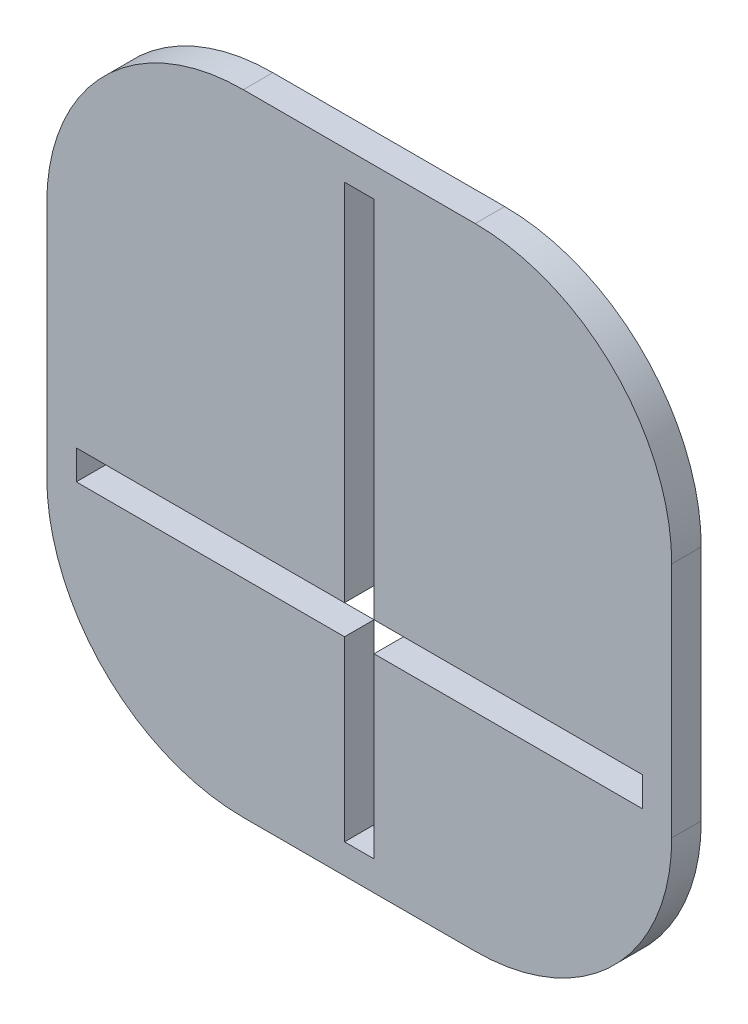
ISO-10303-21;
HEADER;
FILE_DESCRIPTION(('STEP AP214'),'2;1');
FILE_NAME('part.step','',(''),(''),'','','');
FILE_SCHEMA(('AUTOMOTIVE_DESIGN { 1 0 10303 214 1 1 1 1 }'));
ENDSEC;
DATA;
#1=APPLICATION_CONTEXT('core data for automotive mechanical design processes');
#2=APPLICATION_PROTOCOL_DEFINITION('international standard','automotive_design',2000,#1);
#3=PRODUCT_CONTEXT('',#1,'mechanical');
#4=PRODUCT('Part','Part','',(#3));
#5=PRODUCT_RELATED_PRODUCT_CATEGORY('part','',(#4));
#6=PRODUCT_DEFINITION_FORMATION('','',#4);
#7=PRODUCT_DEFINITION_CONTEXT('part definition',#1,'design');
#8=PRODUCT_DEFINITION('design','',#6,#7);
#9=PRODUCT_DEFINITION_SHAPE('','',#8);
#10=(LENGTH_UNIT() NAMED_UNIT(*) SI_UNIT(.MILLI.,.METRE.));
#11=(NAMED_UNIT(*) PLANE_ANGLE_UNIT() SI_UNIT($,.RADIAN.));
#12=(NAMED_UNIT(*) SI_UNIT($,.STERADIAN.) SOLID_ANGLE_UNIT());
#13=UNCERTAINTY_MEASURE_WITH_UNIT(LENGTH_MEASURE(1.E-05),#10,'distance_accuracy_value','');
#14=(GEOMETRIC_REPRESENTATION_CONTEXT(3) GLOBAL_UNCERTAINTY_ASSIGNED_CONTEXT((#13)) GLOBAL_UNIT_ASSIGNED_CONTEXT((#10,
#11,#12)) REPRESENTATION_CONTEXT('',''));
#15=CARTESIAN_POINT('',(0.,0.,0.));
#16=DIRECTION('',(0.,0.,1.));
#17=DIRECTION('',(1.,0.,0.));
#18=AXIS2_PLACEMENT_3D('',#15,#16,#17);
#19=CARTESIAN_POINT('',(0.,32.0700000000001,3.));
#20=DIRECTION('',(0.,-1.,0.));
#21=DIRECTION('',(1.,0.,0.));
#22=AXIS2_PLACEMENT_3D('',#19,#20,#21);
#23=PLANE('',#22);
#24=DIRECTION('',(-1.,0.,0.));
#25=VECTOR('',#24,1.);
#26=CARTESIAN_POINT('',(0.,32.0700000000001,0.));
#27=LINE('',#26,#25);
#28=CARTESIAN_POINT('',(11.8,32.0700000000001,0.));
#29=VERTEX_POINT('',#28);
#30=CARTESIAN_POINT('',(-11.8,32.0700000000001,0.));
#31=VERTEX_POINT('',#30);
#32=EDGE_CURVE('E254',#29,#31,#27,.T.);
#33=ORIENTED_EDGE('',*,*,#32,.T.);
#34=DIRECTION('',(0.,0.,-1.));
#35=VECTOR('',#34,1.);
#36=CARTESIAN_POINT('',(-11.8,32.0700000000001,3.));
#37=LINE('',#36,#35);
#38=CARTESIAN_POINT('',(-11.8,32.0700000000001,3.));
#39=VERTEX_POINT('',#38);
#40=EDGE_CURVE('E11',#39,#31,#37,.T.);
#41=ORIENTED_EDGE('',*,*,#40,.F.);
#42=DIRECTION('',(-1.,0.,0.));
#43=VECTOR('',#42,1.);
#44=CARTESIAN_POINT('',(0.,32.0700000000001,3.));
#45=LINE('',#44,#43);
#46=CARTESIAN_POINT('',(11.8,32.0700000000001,3.));
#47=VERTEX_POINT('',#46);
#48=EDGE_CURVE('E405',#47,#39,#45,.T.);
#49=ORIENTED_EDGE('',*,*,#48,.F.);
#50=DIRECTION('',(0.,0.,-1.));
#51=VECTOR('',#50,1.);
#52=CARTESIAN_POINT('',(11.8,32.0700000000001,3.));
#53=LINE('',#52,#51);
#54=EDGE_CURVE('E281',#47,#29,#53,.T.);
#55=ORIENTED_EDGE('',*,*,#54,.T.);
#56=EDGE_LOOP('',(#33,#41,#49,#55));
#57=FACE_BOUND('',#56,.T.);
#58=ADVANCED_FACE('F45',(#57),#23,.F.);
#59=CARTESIAN_POINT('',(-11.8,12.07,3.));
#60=DIRECTION('',(0.,0.,-1.));
#61=DIRECTION('',(-1.,0.,0.));
#62=AXIS2_PLACEMENT_3D('',#59,#60,#61);
#63=CYLINDRICAL_SURFACE('',#62,20.);
#64=CARTESIAN_POINT('',(-11.8,12.07,0.));
#65=DIRECTION('',(0.,0.,1.));
#66=DIRECTION('',(1.,0.,0.));
#67=AXIS2_PLACEMENT_3D('',#64,#65,#66);
#68=CIRCLE('',#67,20.);
#69=CARTESIAN_POINT('',(-31.8,12.07,0.));
#70=VERTEX_POINT('',#69);
#71=EDGE_CURVE('E258',#31,#70,#68,.T.);
#72=ORIENTED_EDGE('',*,*,#71,.T.);
#73=DIRECTION('',(0.,0.,-1.));
#74=VECTOR('',#73,1.);
#75=CARTESIAN_POINT('',(-31.8,12.07,3.));
#76=LINE('',#75,#74);
#77=CARTESIAN_POINT('',(-31.8,12.07,3.));
#78=VERTEX_POINT('',#77);
#79=EDGE_CURVE('E56',#78,#70,#76,.T.);
#80=ORIENTED_EDGE('',*,*,#79,.F.);
#81=CARTESIAN_POINT('',(-11.8,12.07,3.));
#82=DIRECTION('',(0.,0.,1.));
#83=DIRECTION('',(1.,0.,0.));
#84=AXIS2_PLACEMENT_3D('',#81,#82,#83);
#85=CIRCLE('',#84,20.);
#86=EDGE_CURVE('E408',#39,#78,#85,.T.);
#87=ORIENTED_EDGE('',*,*,#86,.F.);
#88=ORIENTED_EDGE('',*,*,#40,.T.);
#89=EDGE_LOOP('',(#72,#80,#87,#88));
#90=FACE_BOUND('',#89,.T.);
#91=ADVANCED_FACE('F440',(#90),#63,.T.);
#92=CARTESIAN_POINT('',(-31.8,0.,3.));
#93=DIRECTION('',(-1.,0.,0.));
#94=DIRECTION('',(0.,-1.,0.));
#95=AXIS2_PLACEMENT_3D('',#92,#93,#94);
#96=PLANE('',#95);
#97=DIRECTION('',(0.,1.,0.));
#98=VECTOR('',#97,1.);
#99=CARTESIAN_POINT('',(-31.8,0.,0.));
#100=LINE('',#99,#98);
#101=CARTESIAN_POINT('',(-31.8,-12.07,0.));
#102=VERTEX_POINT('',#101);
#103=EDGE_CURVE('E262',#102,#70,#100,.T.);
#104=ORIENTED_EDGE('',*,*,#103,.F.);
#105=DIRECTION('',(0.,0.,-1.));
#106=VECTOR('',#105,1.);
#107=CARTESIAN_POINT('',(-31.8,-12.07,3.));
#108=LINE('',#107,#106);
#109=CARTESIAN_POINT('',(-31.8,-12.07,3.));
#110=VERTEX_POINT('',#109);
#111=EDGE_CURVE('E291',#110,#102,#108,.T.);
#112=ORIENTED_EDGE('',*,*,#111,.F.);
#113=DIRECTION('',(0.,1.,0.));
#114=VECTOR('',#113,1.);
#115=CARTESIAN_POINT('',(-31.8,0.,3.));
#116=LINE('',#115,#114);
#117=EDGE_CURVE('E411',#110,#78,#116,.T.);
#118=ORIENTED_EDGE('',*,*,#117,.T.);
#119=ORIENTED_EDGE('',*,*,#79,.T.);
#120=EDGE_LOOP('',(#104,#112,#118,#119));
#121=FACE_BOUND('',#120,.T.);
#122=ADVANCED_FACE('F445',(#121),#96,.T.);
#123=CARTESIAN_POINT('',(-11.8,-12.07,3.));
#124=DIRECTION('',(0.,0.,-1.));
#125=DIRECTION('',(-1.,0.,0.));
#126=AXIS2_PLACEMENT_3D('',#123,#124,#125);
#127=CYLINDRICAL_SURFACE('',#126,20.);
#128=CARTESIAN_POINT('',(-11.8,-12.07,0.));
#129=DIRECTION('',(0.,0.,1.));
#130=DIRECTION('',(1.,0.,0.));
#131=AXIS2_PLACEMENT_3D('',#128,#129,#130);
#132=CIRCLE('',#131,20.);
#133=CARTESIAN_POINT('',(-11.8,-32.07,0.));
#134=VERTEX_POINT('',#133);
#135=EDGE_CURVE('E266',#134,#102,#132,.F.);
#136=ORIENTED_EDGE('',*,*,#135,.F.);
#137=DIRECTION('',(0.,0.,-1.));
#138=VECTOR('',#137,1.);
#139=CARTESIAN_POINT('',(-11.8,-32.07,3.));
#140=LINE('',#139,#138);
#141=CARTESIAN_POINT('',(-11.8,-32.07,3.));
#142=VERTEX_POINT('',#141);
#143=EDGE_CURVE('E288',#142,#134,#140,.T.);
#144=ORIENTED_EDGE('',*,*,#143,.F.);
#145=CARTESIAN_POINT('',(-11.8,-12.07,3.));
#146=DIRECTION('',(0.,0.,1.));
#147=DIRECTION('',(1.,0.,0.));
#148=AXIS2_PLACEMENT_3D('',#145,#146,#147);
#149=CIRCLE('',#148,20.);
#150=EDGE_CURVE('E415',#142,#110,#149,.F.);
#151=ORIENTED_EDGE('',*,*,#150,.T.);
#152=ORIENTED_EDGE('',*,*,#111,.T.);
#153=EDGE_LOOP('',(#136,#144,#151,#152));
#154=FACE_BOUND('',#153,.T.);
#155=ADVANCED_FACE('F608',(#154),#127,.T.);
#156=CARTESIAN_POINT('',(0.,-32.07,3.));
#157=DIRECTION('',(0.,-1.,0.));
#158=DIRECTION('',(1.,0.,0.));
#159=AXIS2_PLACEMENT_3D('',#156,#157,#158);
#160=PLANE('',#159);
#161=DIRECTION('',(-1.,0.,0.));
#162=VECTOR('',#161,1.);
#163=CARTESIAN_POINT('',(0.,-32.07,0.));
#164=LINE('',#163,#162);
#165=CARTESIAN_POINT('',(11.8,-32.07,0.));
#166=VERTEX_POINT('',#165);
#167=EDGE_CURVE('E270',#166,#134,#164,.T.);
#168=ORIENTED_EDGE('',*,*,#167,.F.);
#169=DIRECTION('',(0.,0.,-1.));
#170=VECTOR('',#169,1.);
#171=CARTESIAN_POINT('',(11.8,-32.07,3.));
#172=LINE('',#171,#170);
#173=CARTESIAN_POINT('',(11.8,-32.07,3.));
#174=VERTEX_POINT('',#173);
#175=EDGE_CURVE('E212',#174,#166,#172,.T.);
#176=ORIENTED_EDGE('',*,*,#175,.F.);
#177=DIRECTION('',(-1.,0.,0.));
#178=VECTOR('',#177,1.);
#179=CARTESIAN_POINT('',(0.,-32.07,3.));
#180=LINE('',#179,#178);
#181=EDGE_CURVE('E203',#174,#142,#180,.T.);
#182=ORIENTED_EDGE('',*,*,#181,.T.);
#183=ORIENTED_EDGE('',*,*,#143,.T.);
#184=EDGE_LOOP('',(#168,#176,#182,#183));
#185=FACE_BOUND('',#184,.T.);
#186=ADVANCED_FACE('F421',(#185),#160,.T.);
#187=CARTESIAN_POINT('',(11.8,-12.07,3.));
#188=DIRECTION('',(0.,0.,-1.));
#189=DIRECTION('',(-1.,0.,0.));
#190=AXIS2_PLACEMENT_3D('',#187,#188,#189);
#191=CYLINDRICAL_SURFACE('',#190,20.);
#192=CARTESIAN_POINT('',(11.8,-12.07,0.));
#193=DIRECTION('',(0.,0.,1.));
#194=DIRECTION('',(1.,0.,0.));
#195=AXIS2_PLACEMENT_3D('',#192,#193,#194);
#196=CIRCLE('',#195,20.);
#197=CARTESIAN_POINT('',(31.8,-12.07,0.));
#198=VERTEX_POINT('',#197);
#199=EDGE_CURVE('E210',#166,#198,#196,.T.);
#200=ORIENTED_EDGE('',*,*,#199,.T.);
#201=DIRECTION('',(0.,0.,-1.));
#202=VECTOR('',#201,1.);
#203=CARTESIAN_POINT('',(31.8,-12.07,3.));
#204=LINE('',#203,#202);
#205=CARTESIAN_POINT('',(31.8,-12.07,3.));
#206=VERTEX_POINT('',#205);
#207=EDGE_CURVE('E207',#206,#198,#204,.T.);
#208=ORIENTED_EDGE('',*,*,#207,.F.);
#209=CARTESIAN_POINT('',(11.8,-12.07,3.));
#210=DIRECTION('',(0.,0.,1.));
#211=DIRECTION('',(1.,0.,0.));
#212=AXIS2_PLACEMENT_3D('',#209,#210,#211);
#213=CIRCLE('',#212,20.);
#214=EDGE_CURVE('E196',#174,#206,#213,.T.);
#215=ORIENTED_EDGE('',*,*,#214,.F.);
#216=ORIENTED_EDGE('',*,*,#175,.T.);
#217=EDGE_LOOP('',(#200,#208,#215,#216));
#218=FACE_BOUND('',#217,.T.);
#219=ADVANCED_FACE('F208',(#218),#191,.T.);
#220=CARTESIAN_POINT('',(31.8,0.,3.));
#221=DIRECTION('',(-1.,0.,0.));
#222=DIRECTION('',(0.,0.,1.));
#223=AXIS2_PLACEMENT_3D('',#220,#221,#222);
#224=PLANE('',#223);
#225=DIRECTION('',(0.,1.,0.));
#226=VECTOR('',#225,1.);
#227=CARTESIAN_POINT('',(31.8,0.,0.));
#228=LINE('',#227,#226);
#229=CARTESIAN_POINT('',(31.8,12.0700000000001,0.));
#230=VERTEX_POINT('',#229);
#231=EDGE_CURVE('E130',#198,#230,#228,.T.);
#232=ORIENTED_EDGE('',*,*,#231,.T.);
#233=DIRECTION('',(0.,0.,-1.));
#234=VECTOR('',#233,1.);
#235=CARTESIAN_POINT('',(31.8,12.0700000000001,3.));
#236=LINE('',#235,#234);
#237=CARTESIAN_POINT('',(31.8,12.0700000000001,3.));
#238=VERTEX_POINT('',#237);
#239=EDGE_CURVE('E213',#238,#230,#236,.T.);
#240=ORIENTED_EDGE('',*,*,#239,.F.);
#241=DIRECTION('',(0.,1.,0.));
#242=VECTOR('',#241,1.);
#243=CARTESIAN_POINT('',(31.8,0.,3.));
#244=LINE('',#243,#242);
#245=EDGE_CURVE('E200',#206,#238,#244,.T.);
#246=ORIENTED_EDGE('',*,*,#245,.F.);
#247=ORIENTED_EDGE('',*,*,#207,.T.);
#248=EDGE_LOOP('',(#232,#240,#246,#247));
#249=FACE_BOUND('',#248,.T.);
#250=ADVANCED_FACE('F215',(#249),#224,.F.);
#251=CARTESIAN_POINT('',(0.,29.07,3.));
#252=DIRECTION('',(0.,1.,0.));
#253=DIRECTION('',(0.,0.,1.));
#254=AXIS2_PLACEMENT_3D('',#251,#252,#253);
#255=PLANE('',#254);
#256=DIRECTION('',(1.,0.,0.));
#257=VECTOR('',#256,1.);
#258=CARTESIAN_POINT('',(0.,29.07,0.));
#259=LINE('',#258,#257);
#260=CARTESIAN_POINT('',(-1.50000000000001,29.07,0.));
#261=VERTEX_POINT('',#260);
#262=CARTESIAN_POINT('',(1.50000000000001,29.07,0.));
#263=VERTEX_POINT('',#262);
#264=EDGE_CURVE('E223',#261,#263,#259,.T.);
#265=ORIENTED_EDGE('',*,*,#264,.T.);
#266=DIRECTION('',(0.,0.,-1.));
#267=VECTOR('',#266,1.);
#268=CARTESIAN_POINT('',(1.50000000000001,29.07,3.));
#269=LINE('',#268,#267);
#270=CARTESIAN_POINT('',(1.50000000000001,29.07,3.));
#271=VERTEX_POINT('',#270);
#272=EDGE_CURVE('E49',#271,#263,#269,.T.);
#273=ORIENTED_EDGE('',*,*,#272,.F.);
#274=DIRECTION('',(1.,0.,0.));
#275=VECTOR('',#274,1.);
#276=CARTESIAN_POINT('',(0.,29.07,3.));
#277=LINE('',#276,#275);
#278=CARTESIAN_POINT('',(-1.50000000000001,29.07,3.));
#279=VERTEX_POINT('',#278);
#280=EDGE_CURVE('E280',#279,#271,#277,.T.);
#281=ORIENTED_EDGE('',*,*,#280,.F.);
#282=DIRECTION('',(0.,0.,-1.));
#283=VECTOR('',#282,1.);
#284=CARTESIAN_POINT('',(-1.50000000000001,29.07,3.));
#285=LINE('',#284,#283);
#286=EDGE_CURVE('E219',#279,#261,#285,.T.);
#287=ORIENTED_EDGE('',*,*,#286,.T.);
#288=EDGE_LOOP('',(#265,#273,#281,#287));
#289=FACE_BOUND('',#288,.T.);
#290=ADVANCED_FACE('F47',(#289),#255,.F.);
#291=CARTESIAN_POINT('',(1.50000000000001,0.,3.));
#292=DIRECTION('',(1.,0.,0.));
#293=DIRECTION('',(0.,0.,-1.));
#294=AXIS2_PLACEMENT_3D('',#291,#292,#293);
#295=PLANE('',#294);
#296=DIRECTION('',(0.,-1.,0.));
#297=VECTOR('',#296,1.);
#298=CARTESIAN_POINT('',(1.50000000000001,0.,0.));
#299=LINE('',#298,#297);
#300=CARTESIAN_POINT('',(1.50000000000001,-7.99500000000001,0.));
#301=VERTEX_POINT('',#300);
#302=EDGE_CURVE('E227',#263,#301,#299,.T.);
#303=ORIENTED_EDGE('',*,*,#302,.T.);
#304=DIRECTION('',(0.,0.,-1.));
#305=VECTOR('',#304,1.);
#306=CARTESIAN_POINT('',(1.50000000000001,-7.99500000000001,3.));
#307=LINE('',#306,#305);
#308=CARTESIAN_POINT('',(1.50000000000001,-7.99500000000001,3.));
#309=VERTEX_POINT('',#308);
#310=EDGE_CURVE('E329',#309,#301,#307,.T.);
#311=ORIENTED_EDGE('',*,*,#310,.F.);
#312=DIRECTION('',(0.,-1.,0.));
#313=VECTOR('',#312,1.);
#314=CARTESIAN_POINT('',(1.50000000000001,0.,3.));
#315=LINE('',#314,#313);
#316=EDGE_CURVE('E145',#271,#309,#315,.T.);
#317=ORIENTED_EDGE('',*,*,#316,.F.);
#318=ORIENTED_EDGE('',*,*,#272,.T.);
#319=EDGE_LOOP('',(#303,#311,#317,#318));
#320=FACE_BOUND('',#319,.T.);
#321=ADVANCED_FACE('F337',(#320),#295,.F.);
#322=CARTESIAN_POINT('',(0.,-7.99500000000001,3.));
#323=DIRECTION('',(0.,1.,0.));
#324=DIRECTION('',(0.,0.,1.));
#325=AXIS2_PLACEMENT_3D('',#322,#323,#324);
#326=PLANE('',#325);
#327=DIRECTION('',(1.,0.,0.));
#328=VECTOR('',#327,1.);
#329=CARTESIAN_POINT('',(0.,-7.99500000000001,0.));
#330=LINE('',#329,#328);
#331=CARTESIAN_POINT('',(28.8,-7.99500000000001,0.));
#332=VERTEX_POINT('',#331);
#333=EDGE_CURVE('E230',#301,#332,#330,.T.);
#334=ORIENTED_EDGE('',*,*,#333,.T.);
#335=DIRECTION('',(0.,0.,-1.));
#336=VECTOR('',#335,1.);
#337=CARTESIAN_POINT('',(28.8,-7.99500000000001,3.));
#338=LINE('',#337,#336);
#339=CARTESIAN_POINT('',(28.8,-7.99500000000001,3.));
#340=VERTEX_POINT('',#339);
#341=EDGE_CURVE('E326',#340,#332,#338,.T.);
#342=ORIENTED_EDGE('',*,*,#341,.F.);
#343=DIRECTION('',(1.,0.,0.));
#344=VECTOR('',#343,1.);
#345=CARTESIAN_POINT('',(0.,-7.99500000000001,3.));
#346=LINE('',#345,#344);
#347=EDGE_CURVE('E477',#309,#340,#346,.T.);
#348=ORIENTED_EDGE('',*,*,#347,.F.);
#349=ORIENTED_EDGE('',*,*,#310,.T.);
#350=EDGE_LOOP('',(#334,#342,#348,#349));
#351=FACE_BOUND('',#350,.T.);
#352=ADVANCED_FACE('F452',(#351),#326,.F.);
#353=CARTESIAN_POINT('',(28.8,0.,3.));
#354=DIRECTION('',(1.,0.,0.));
#355=DIRECTION('',(0.,0.,-1.));
#356=AXIS2_PLACEMENT_3D('',#353,#354,#355);
#357=PLANE('',#356);
#358=DIRECTION('',(0.,-1.,0.));
#359=VECTOR('',#358,1.);
#360=CARTESIAN_POINT('',(28.8,0.,0.));
#361=LINE('',#360,#359);
#362=CARTESIAN_POINT('',(28.8,-10.995,0.));
#363=VERTEX_POINT('',#362);
#364=EDGE_CURVE('E234',#332,#363,#361,.T.);
#365=ORIENTED_EDGE('',*,*,#364,.T.);
#366=DIRECTION('',(0.,0.,-1.));
#367=VECTOR('',#366,1.);
#368=CARTESIAN_POINT('',(28.8,-10.995,3.));
#369=LINE('',#368,#367);
#370=CARTESIAN_POINT('',(28.8,-10.995,3.));
#371=VERTEX_POINT('',#370);
#372=EDGE_CURVE('E322',#371,#363,#369,.T.);
#373=ORIENTED_EDGE('',*,*,#372,.F.);
#374=DIRECTION('',(0.,-1.,0.));
#375=VECTOR('',#374,1.);
#376=CARTESIAN_POINT('',(28.8,0.,3.));
#377=LINE('',#376,#375);
#378=EDGE_CURVE('E475',#340,#371,#377,.T.);
#379=ORIENTED_EDGE('',*,*,#378,.F.);
#380=ORIENTED_EDGE('',*,*,#341,.T.);
#381=EDGE_LOOP('',(#365,#373,#379,#380));
#382=FACE_BOUND('',#381,.T.);
#383=ADVANCED_FACE('F461',(#382),#357,.F.);
#384=CARTESIAN_POINT('',(0.,-10.995,3.));
#385=DIRECTION('',(0.,-1.,0.));
#386=DIRECTION('',(0.,0.,-1.));
#387=AXIS2_PLACEMENT_3D('',#384,#385,#386);
#388=PLANE('',#387);
#389=DIRECTION('',(-1.,0.,0.));
#390=VECTOR('',#389,1.);
#391=CARTESIAN_POINT('',(0.,-10.995,0.));
#392=LINE('',#391,#390);
#393=CARTESIAN_POINT('',(1.50000000000001,-10.995,0.));
#394=VERTEX_POINT('',#393);
#395=EDGE_CURVE('E238',#363,#394,#392,.T.);
#396=ORIENTED_EDGE('',*,*,#395,.T.);
#397=DIRECTION('',(0.,0.,-1.));
#398=VECTOR('',#397,1.);
#399=CARTESIAN_POINT('',(1.50000000000001,-10.995,3.));
#400=LINE('',#399,#398);
#401=CARTESIAN_POINT('',(1.50000000000001,-10.995,3.));
#402=VERTEX_POINT('',#401);
#403=EDGE_CURVE('E318',#402,#394,#400,.T.);
#404=ORIENTED_EDGE('',*,*,#403,.F.);
#405=DIRECTION('',(-1.,0.,0.));
#406=VECTOR('',#405,1.);
#407=CARTESIAN_POINT('',(0.,-10.995,3.));
#408=LINE('',#407,#406);
#409=EDGE_CURVE('E397',#371,#402,#408,.T.);
#410=ORIENTED_EDGE('',*,*,#409,.F.);
#411=ORIENTED_EDGE('',*,*,#372,.T.);
#412=EDGE_LOOP('',(#396,#404,#410,#411));
#413=FACE_BOUND('',#412,.T.);
#414=ADVANCED_FACE('F457',(#413),#388,.F.);
#415=CARTESIAN_POINT('',(1.50000000000001,-29.07,0.));
#416=VERTEX_POINT('',#415);
#417=EDGE_CURVE('E231',#394,#416,#299,.T.);
#418=ORIENTED_EDGE('',*,*,#417,.T.);
#419=DIRECTION('',(0.,0.,-1.));
#420=VECTOR('',#419,1.);
#421=CARTESIAN_POINT('',(1.50000000000001,-29.07,3.));
#422=LINE('',#421,#420);
#423=CARTESIAN_POINT('',(1.50000000000001,-29.07,3.));
#424=VERTEX_POINT('',#423);
#425=EDGE_CURVE('E315',#424,#416,#422,.T.);
#426=ORIENTED_EDGE('',*,*,#425,.F.);
#427=EDGE_CURVE('E391',#402,#424,#315,.T.);
#428=ORIENTED_EDGE('',*,*,#427,.F.);
#429=ORIENTED_EDGE('',*,*,#403,.T.);
#430=EDGE_LOOP('',(#418,#426,#428,#429));
#431=FACE_BOUND('',#430,.T.);
#432=ADVANCED_FACE('F377',(#431),#295,.F.);
#433=CARTESIAN_POINT('',(0.,-29.07,3.));
#434=DIRECTION('',(0.,1.,0.));
#435=DIRECTION('',(0.,0.,1.));
#436=AXIS2_PLACEMENT_3D('',#433,#434,#435);
#437=PLANE('',#436);
#438=DIRECTION('',(1.,0.,0.));
#439=VECTOR('',#438,1.);
#440=CARTESIAN_POINT('',(0.,-29.07,0.));
#441=LINE('',#440,#439);
#442=CARTESIAN_POINT('',(-1.50000000000001,-29.07,0.));
#443=VERTEX_POINT('',#442);
#444=EDGE_CURVE('E242',#443,#416,#441,.T.);
#445=ORIENTED_EDGE('',*,*,#444,.F.);
#446=DIRECTION('',(0.,0.,-1.));
#447=VECTOR('',#446,1.);
#448=CARTESIAN_POINT('',(-1.50000000000001,-29.07,3.));
#449=LINE('',#448,#447);
#450=CARTESIAN_POINT('',(-1.50000000000001,-29.07,3.));
#451=VERTEX_POINT('',#450);
#452=EDGE_CURVE('E312',#451,#443,#449,.T.);
#453=ORIENTED_EDGE('',*,*,#452,.F.);
#454=DIRECTION('',(1.,0.,0.));
#455=VECTOR('',#454,1.);
#456=CARTESIAN_POINT('',(0.,-29.07,3.));
#457=LINE('',#456,#455);
#458=EDGE_CURVE('E386',#451,#424,#457,.T.);
#459=ORIENTED_EDGE('',*,*,#458,.T.);
#460=ORIENTED_EDGE('',*,*,#425,.T.);
#461=EDGE_LOOP('',(#445,#453,#459,#460));
#462=FACE_BOUND('',#461,.T.);
#463=ADVANCED_FACE('F384',(#462),#437,.T.);
#464=CARTESIAN_POINT('',(-1.50000000000001,0.,3.));
#465=DIRECTION('',(1.,0.,0.));
#466=DIRECTION('',(0.,0.,-1.));
#467=AXIS2_PLACEMENT_3D('',#464,#465,#466);
#468=PLANE('',#467);
#469=DIRECTION('',(0.,-1.,0.));
#470=VECTOR('',#469,1.);
#471=CARTESIAN_POINT('',(-1.50000000000001,0.,0.));
#472=LINE('',#471,#470);
#473=CARTESIAN_POINT('',(-1.50000000000001,-10.995,0.));
#474=VERTEX_POINT('',#473);
#475=EDGE_CURVE('E246',#474,#443,#472,.T.);
#476=ORIENTED_EDGE('',*,*,#475,.F.);
#477=DIRECTION('',(0.,0.,-1.));
#478=VECTOR('',#477,1.);
#479=CARTESIAN_POINT('',(-1.50000000000001,-10.995,3.));
#480=LINE('',#479,#478);
#481=CARTESIAN_POINT('',(-1.50000000000001,-10.995,3.));
#482=VERTEX_POINT('',#481);
#483=EDGE_CURVE('E309',#482,#474,#480,.T.);
#484=ORIENTED_EDGE('',*,*,#483,.F.);
#485=DIRECTION('',(0.,-1.,0.));
#486=VECTOR('',#485,1.);
#487=CARTESIAN_POINT('',(-1.50000000000001,0.,3.));
#488=LINE('',#487,#486);
#489=EDGE_CURVE('E390',#482,#451,#488,.T.);
#490=ORIENTED_EDGE('',*,*,#489,.T.);
#491=ORIENTED_EDGE('',*,*,#452,.T.);
#492=EDGE_LOOP('',(#476,#484,#490,#491));
#493=FACE_BOUND('',#492,.T.);
#494=ADVANCED_FACE('F436',(#493),#468,.T.);
#495=CARTESIAN_POINT('',(-28.8,-10.995,0.));
#496=VERTEX_POINT('',#495);
#497=EDGE_CURVE('E241',#474,#496,#392,.T.);
#498=ORIENTED_EDGE('',*,*,#497,.T.);
#499=DIRECTION('',(0.,0.,-1.));
#500=VECTOR('',#499,1.);
#501=CARTESIAN_POINT('',(-28.8,-10.995,3.));
#502=LINE('',#501,#500);
#503=CARTESIAN_POINT('',(-28.8,-10.995,3.));
#504=VERTEX_POINT('',#503);
#505=EDGE_CURVE('E305',#504,#496,#502,.T.);
#506=ORIENTED_EDGE('',*,*,#505,.F.);
#507=EDGE_CURVE('E369',#482,#504,#408,.T.);
#508=ORIENTED_EDGE('',*,*,#507,.F.);
#509=ORIENTED_EDGE('',*,*,#483,.T.);
#510=EDGE_LOOP('',(#498,#506,#508,#509));
#511=FACE_BOUND('',#510,.T.);
#512=ADVANCED_FACE('F368',(#511),#388,.F.);
#513=CARTESIAN_POINT('',(-28.8,0.,3.));
#514=DIRECTION('',(-1.,0.,0.));
#515=DIRECTION('',(0.,0.,1.));
#516=AXIS2_PLACEMENT_3D('',#513,#514,#515);
#517=PLANE('',#516);
#518=DIRECTION('',(0.,1.,0.));
#519=VECTOR('',#518,1.);
#520=CARTESIAN_POINT('',(-28.8,0.,0.));
#521=LINE('',#520,#519);
#522=CARTESIAN_POINT('',(-28.8,-7.99500000000001,0.));
#523=VERTEX_POINT('',#522);
#524=EDGE_CURVE('E251',#496,#523,#521,.T.);
#525=ORIENTED_EDGE('',*,*,#524,.T.);
#526=DIRECTION('',(0.,0.,-1.));
#527=VECTOR('',#526,1.);
#528=CARTESIAN_POINT('',(-28.8,-7.99500000000001,3.));
#529=LINE('',#528,#527);
#530=CARTESIAN_POINT('',(-28.8,-7.99500000000001,3.));
#531=VERTEX_POINT('',#530);
#532=EDGE_CURVE('E301',#531,#523,#529,.T.);
#533=ORIENTED_EDGE('',*,*,#532,.F.);
#534=DIRECTION('',(0.,1.,0.));
#535=VECTOR('',#534,1.);
#536=CARTESIAN_POINT('',(-28.8,0.,3.));
#537=LINE('',#536,#535);
#538=EDGE_CURVE('E365',#504,#531,#537,.T.);
#539=ORIENTED_EDGE('',*,*,#538,.F.);
#540=ORIENTED_EDGE('',*,*,#505,.T.);
#541=EDGE_LOOP('',(#525,#533,#539,#540));
#542=FACE_BOUND('',#541,.T.);
#543=ADVANCED_FACE('F362',(#542),#517,.F.);
#544=CARTESIAN_POINT('',(-1.50000000000001,-7.99500000000001,0.));
#545=VERTEX_POINT('',#544);
#546=EDGE_CURVE('E235',#523,#545,#330,.T.);
#547=ORIENTED_EDGE('',*,*,#546,.T.);
#548=DIRECTION('',(0.,0.,-1.));
#549=VECTOR('',#548,1.);
#550=CARTESIAN_POINT('',(-1.50000000000001,-7.99500000000001,3.));
#551=LINE('',#550,#549);
#552=CARTESIAN_POINT('',(-1.50000000000001,-7.99500000000001,3.));
#553=VERTEX_POINT('',#552);
#554=EDGE_CURVE('E298',#553,#545,#551,.T.);
#555=ORIENTED_EDGE('',*,*,#554,.F.);
#556=EDGE_CURVE('E404',#531,#553,#346,.T.);
#557=ORIENTED_EDGE('',*,*,#556,.F.);
#558=ORIENTED_EDGE('',*,*,#532,.T.);
#559=EDGE_LOOP('',(#547,#555,#557,#558));
#560=FACE_BOUND('',#559,.T.);
#561=ADVANCED_FACE('F355',(#560),#326,.F.);
#562=EDGE_CURVE('E250',#261,#545,#472,.T.);
#563=ORIENTED_EDGE('',*,*,#562,.F.);
#564=ORIENTED_EDGE('',*,*,#286,.F.);
#565=EDGE_CURVE('E396',#279,#553,#488,.T.);
#566=ORIENTED_EDGE('',*,*,#565,.T.);
#567=ORIENTED_EDGE('',*,*,#554,.T.);
#568=EDGE_LOOP('',(#563,#564,#566,#567));
#569=FACE_BOUND('',#568,.T.);
#570=ADVANCED_FACE('F348',(#569),#468,.T.);
#571=CARTESIAN_POINT('',(11.8,12.0700000000001,3.));
#572=DIRECTION('',(0.,0.,-1.));
#573=DIRECTION('',(-1.,0.,0.));
#574=AXIS2_PLACEMENT_3D('',#571,#572,#573);
#575=CYLINDRICAL_SURFACE('',#574,20.);
#576=CARTESIAN_POINT('',(11.8,12.0700000000001,0.));
#577=DIRECTION('',(0.,0.,1.));
#578=DIRECTION('',(1.,0.,0.));
#579=AXIS2_PLACEMENT_3D('',#576,#577,#578);
#580=CIRCLE('',#579,20.);
#581=EDGE_CURVE('E136',#230,#29,#580,.T.);
#582=ORIENTED_EDGE('',*,*,#581,.T.);
#583=ORIENTED_EDGE('',*,*,#54,.F.);
#584=CARTESIAN_POINT('',(11.8,12.0700000000001,3.));
#585=DIRECTION('',(0.,0.,1.));
#586=DIRECTION('',(1.,0.,0.));
#587=AXIS2_PLACEMENT_3D('',#584,#585,#586);
#588=CIRCLE('',#587,20.);
#589=EDGE_CURVE('E65',#238,#47,#588,.T.);
#590=ORIENTED_EDGE('',*,*,#589,.F.);
#591=ORIENTED_EDGE('',*,*,#239,.T.);
#592=EDGE_LOOP('',(#582,#583,#590,#591));
#593=FACE_BOUND('',#592,.T.);
#594=ADVANCED_FACE('F427',(#593),#575,.T.);
#595=CARTESIAN_POINT('',(0.,0.,3.));
#596=DIRECTION('',(0.,0.,1.));
#597=DIRECTION('',(1.,0.,0.));
#598=AXIS2_PLACEMENT_3D('',#595,#596,#597);
#599=PLANE('',#598);
#600=ORIENTED_EDGE('',*,*,#280,.T.);
#601=ORIENTED_EDGE('',*,*,#316,.T.);
#602=ORIENTED_EDGE('',*,*,#347,.T.);
#603=ORIENTED_EDGE('',*,*,#378,.T.);
#604=ORIENTED_EDGE('',*,*,#409,.T.);
#605=ORIENTED_EDGE('',*,*,#427,.T.);
#606=ORIENTED_EDGE('',*,*,#458,.F.);
#607=ORIENTED_EDGE('',*,*,#489,.F.);
#608=ORIENTED_EDGE('',*,*,#507,.T.);
#609=ORIENTED_EDGE('',*,*,#538,.T.);
#610=ORIENTED_EDGE('',*,*,#556,.T.);
#611=ORIENTED_EDGE('',*,*,#565,.F.);
#612=EDGE_LOOP('',(#600,#601,#602,#603,#604,#605,#606,#607,#608,#609,#610,#611));
#613=FACE_BOUND('',#612,.T.);
#614=ORIENTED_EDGE('',*,*,#48,.T.);
#615=ORIENTED_EDGE('',*,*,#86,.T.);
#616=ORIENTED_EDGE('',*,*,#117,.F.);
#617=ORIENTED_EDGE('',*,*,#150,.F.);
#618=ORIENTED_EDGE('',*,*,#181,.F.);
#619=ORIENTED_EDGE('',*,*,#214,.T.);
#620=ORIENTED_EDGE('',*,*,#245,.T.);
#621=ORIENTED_EDGE('',*,*,#589,.T.);
#622=EDGE_LOOP('',(#614,#615,#616,#617,#618,#619,#620,#621));
#623=FACE_BOUND('',#622,.T.);
#624=ADVANCED_FACE('F198',(#613,#623),#599,.T.);
#625=CARTESIAN_POINT('',(0.,0.,0.));
#626=DIRECTION('',(0.,0.,1.));
#627=DIRECTION('',(1.,0.,0.));
#628=AXIS2_PLACEMENT_3D('',#625,#626,#627);
#629=PLANE('',#628);
#630=ORIENTED_EDGE('',*,*,#264,.F.);
#631=ORIENTED_EDGE('',*,*,#562,.T.);
#632=ORIENTED_EDGE('',*,*,#546,.F.);
#633=ORIENTED_EDGE('',*,*,#524,.F.);
#634=ORIENTED_EDGE('',*,*,#497,.F.);
#635=ORIENTED_EDGE('',*,*,#475,.T.);
#636=ORIENTED_EDGE('',*,*,#444,.T.);
#637=ORIENTED_EDGE('',*,*,#417,.F.);
#638=ORIENTED_EDGE('',*,*,#395,.F.);
#639=ORIENTED_EDGE('',*,*,#364,.F.);
#640=ORIENTED_EDGE('',*,*,#333,.F.);
#641=ORIENTED_EDGE('',*,*,#302,.F.);
#642=EDGE_LOOP('',(#630,#631,#632,#633,#634,#635,#636,#637,#638,#639,#640,#641));
#643=FACE_BOUND('',#642,.T.);
#644=ORIENTED_EDGE('',*,*,#32,.F.);
#645=ORIENTED_EDGE('',*,*,#581,.F.);
#646=ORIENTED_EDGE('',*,*,#231,.F.);
#647=ORIENTED_EDGE('',*,*,#199,.F.);
#648=ORIENTED_EDGE('',*,*,#167,.T.);
#649=ORIENTED_EDGE('',*,*,#135,.T.);
#650=ORIENTED_EDGE('',*,*,#103,.T.);
#651=ORIENTED_EDGE('',*,*,#71,.F.);
#652=EDGE_LOOP('',(#644,#645,#646,#647,#648,#649,#650,#651));
#653=FACE_BOUND('',#652,.T.);
#654=ADVANCED_FACE('F344',(#643,#653),#629,.F.);
#655=CLOSED_SHELL('',(#58,#91,#122,#155,#186,#219,#250,#290,#321,#352,#383,#414,#432,#463,#494,
#512,#543,#561,#570,#594,#624,#654));
#656=MANIFOLD_SOLID_BREP('B2',#655);
#657=ADVANCED_BREP_SHAPE_REPRESENTATION('',(#18,#656),#14);
#658=SHAPE_DEFINITION_REPRESENTATION(#9,#657);
ENDSEC;
END-ISO-10303-21;
